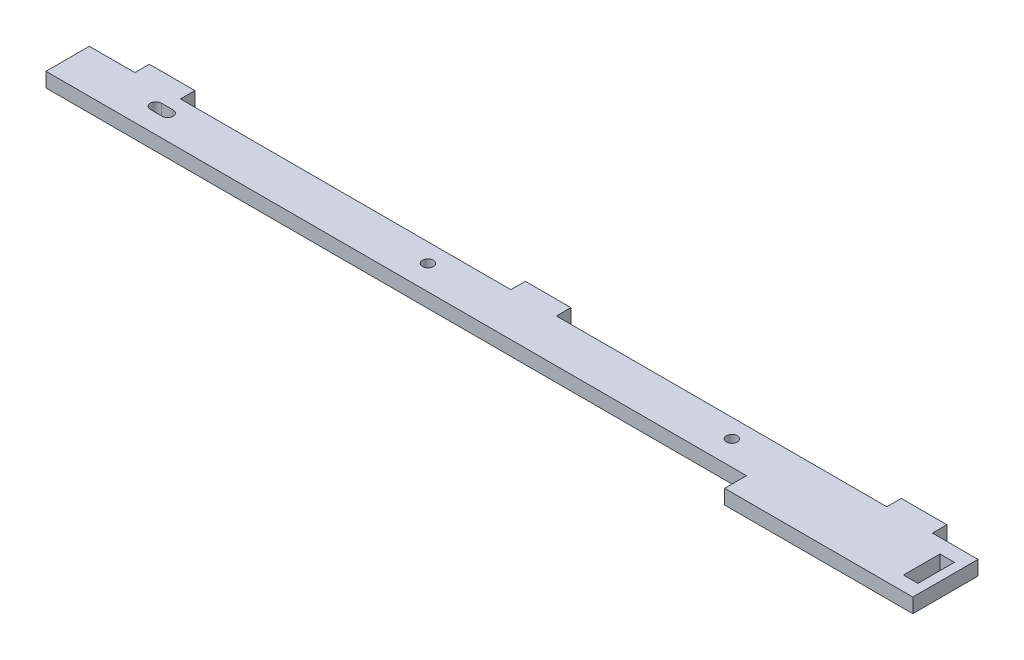
ISO-10303-21;
HEADER;
FILE_DESCRIPTION(('STEP AP214'),'2;1');
FILE_NAME('part.step','',(''),(''),'','','');
FILE_SCHEMA(('AUTOMOTIVE_DESIGN { 1 0 10303 214 1 1 1 1 }'));
ENDSEC;
DATA;
#1=APPLICATION_CONTEXT('core data for automotive mechanical design processes');
#2=APPLICATION_PROTOCOL_DEFINITION('international standard','automotive_design',2000,#1);
#3=PRODUCT_CONTEXT('',#1,'mechanical');
#4=PRODUCT('Part','Part','',(#3));
#5=PRODUCT_RELATED_PRODUCT_CATEGORY('part','',(#4));
#6=PRODUCT_DEFINITION_FORMATION('','',#4);
#7=PRODUCT_DEFINITION_CONTEXT('part definition',#1,'design');
#8=PRODUCT_DEFINITION('design','',#6,#7);
#9=PRODUCT_DEFINITION_SHAPE('','',#8);
#10=(LENGTH_UNIT() NAMED_UNIT(*) SI_UNIT(.MILLI.,.METRE.));
#11=(NAMED_UNIT(*) PLANE_ANGLE_UNIT() SI_UNIT($,.RADIAN.));
#12=(NAMED_UNIT(*) SI_UNIT($,.STERADIAN.) SOLID_ANGLE_UNIT());
#13=UNCERTAINTY_MEASURE_WITH_UNIT(LENGTH_MEASURE(1.E-05),#10,'distance_accuracy_value','');
#14=(GEOMETRIC_REPRESENTATION_CONTEXT(3) GLOBAL_UNCERTAINTY_ASSIGNED_CONTEXT((#13)) GLOBAL_UNIT_ASSIGNED_CONTEXT((#10,
#11,#12)) REPRESENTATION_CONTEXT('',''));
#15=CARTESIAN_POINT('',(0.,0.,0.));
#16=DIRECTION('',(0.,0.,1.));
#17=DIRECTION('',(1.,0.,0.));
#18=AXIS2_PLACEMENT_3D('',#15,#16,#17);
#19=CARTESIAN_POINT('',(97.5,3.175,4.74999999999999));
#20=DIRECTION('',(0.,0.,-1.));
#21=DIRECTION('',(-1.,0.,0.));
#22=AXIS2_PLACEMENT_3D('',#19,#20,#21);
#23=PLANE('',#22);
#24=DIRECTION('',(0.,-1.,0.));
#25=VECTOR('',#24,1.);
#26=CARTESIAN_POINT('',(56.2,3.17499999999999,4.75));
#27=LINE('',#26,#25);
#28=CARTESIAN_POINT('',(56.2,3.175,4.74999999999999));
#29=VERTEX_POINT('',#28);
#30=CARTESIAN_POINT('',(56.2,0.,4.75));
#31=VERTEX_POINT('',#30);
#32=EDGE_CURVE('E337',#29,#31,#27,.T.);
#33=ORIENTED_EDGE('',*,*,#32,.F.);
#34=DIRECTION('',(1.,0.,0.));
#35=VECTOR('',#34,1.);
#36=CARTESIAN_POINT('',(97.5,3.175,4.74999999999999));
#37=LINE('',#36,#35);
#38=CARTESIAN_POINT('',(-97.5,3.175,4.75000000000001));
#39=VERTEX_POINT('',#38);
#40=EDGE_CURVE('E458',#39,#29,#37,.T.);
#41=ORIENTED_EDGE('',*,*,#40,.F.);
#42=DIRECTION('',(0.,-1.,0.));
#43=VECTOR('',#42,1.);
#44=CARTESIAN_POINT('',(-97.5,3.175,4.75000000000001));
#45=LINE('',#44,#43);
#46=CARTESIAN_POINT('',(-97.5,0.,4.75000000000001));
#47=VERTEX_POINT('',#46);
#48=EDGE_CURVE('E486',#39,#47,#45,.T.);
#49=ORIENTED_EDGE('',*,*,#48,.T.);
#50=DIRECTION('',(1.,0.,0.));
#51=VECTOR('',#50,1.);
#52=CARTESIAN_POINT('',(97.5,0.,4.74999999999999));
#53=LINE('',#52,#51);
#54=EDGE_CURVE('E473',#47,#31,#53,.T.);
#55=ORIENTED_EDGE('',*,*,#54,.T.);
#56=EDGE_LOOP('',(#33,#41,#49,#55));
#57=FACE_BOUND('',#56,.T.);
#58=ADVANCED_FACE('F107',(#57),#23,.F.);
#59=CARTESIAN_POINT('',(97.5,3.175,-4.75000000000001));
#60=DIRECTION('',(0.,0.,1.));
#61=DIRECTION('',(1.,0.,0.));
#62=AXIS2_PLACEMENT_3D('',#59,#60,#61);
#63=PLANE('',#62);
#64=DIRECTION('',(0.,1.,0.));
#65=VECTOR('',#64,1.);
#66=CARTESIAN_POINT('',(-5.,0.,-4.75));
#67=LINE('',#66,#65);
#68=CARTESIAN_POINT('',(-5.,0.,-4.75));
#69=VERTEX_POINT('',#68);
#70=CARTESIAN_POINT('',(-5.,3.175,-4.75));
#71=VERTEX_POINT('',#70);
#72=EDGE_CURVE('E361',#69,#71,#67,.T.);
#73=ORIENTED_EDGE('',*,*,#72,.F.);
#74=DIRECTION('',(-1.,0.,0.));
#75=VECTOR('',#74,1.);
#76=CARTESIAN_POINT('',(97.5,0.,-4.75000000000001));
#77=LINE('',#76,#75);
#78=CARTESIAN_POINT('',(-77.5,0.,-4.74999999999999));
#79=VERTEX_POINT('',#78);
#80=EDGE_CURVE('E480',#69,#79,#77,.T.);
#81=ORIENTED_EDGE('',*,*,#80,.T.);
#82=DIRECTION('',(0.,-1.,0.));
#83=VECTOR('',#82,1.);
#84=CARTESIAN_POINT('',(-77.5,0.,-4.74999999999999));
#85=LINE('',#84,#83);
#86=CARTESIAN_POINT('',(-77.5,3.175,-4.74999999999999));
#87=VERTEX_POINT('',#86);
#88=EDGE_CURVE('E420',#87,#79,#85,.T.);
#89=ORIENTED_EDGE('',*,*,#88,.F.);
#90=DIRECTION('',(-1.,0.,0.));
#91=VECTOR('',#90,1.);
#92=CARTESIAN_POINT('',(97.5,3.175,-4.75000000000001));
#93=LINE('',#92,#91);
#94=EDGE_CURVE('E470',#71,#87,#93,.T.);
#95=ORIENTED_EDGE('',*,*,#94,.F.);
#96=EDGE_LOOP('',(#73,#81,#89,#95));
#97=FACE_BOUND('',#96,.T.);
#98=ADVANCED_FACE('F555',(#97),#63,.F.);
#99=DIRECTION('',(0.,-1.,0.));
#100=VECTOR('',#99,1.);
#101=CARTESIAN_POINT('',(5.,0.,-4.75));
#102=LINE('',#101,#100);
#103=CARTESIAN_POINT('',(5.,3.175,-4.75));
#104=VERTEX_POINT('',#103);
#105=CARTESIAN_POINT('',(5.,0.,-4.75));
#106=VERTEX_POINT('',#105);
#107=EDGE_CURVE('E366',#104,#106,#102,.T.);
#108=ORIENTED_EDGE('',*,*,#107,.F.);
#109=CARTESIAN_POINT('',(77.5,3.175,-4.75000000000001));
#110=VERTEX_POINT('',#109);
#111=EDGE_CURVE('E469',#110,#104,#93,.T.);
#112=ORIENTED_EDGE('',*,*,#111,.F.);
#113=DIRECTION('',(0.,1.,0.));
#114=VECTOR('',#113,1.);
#115=CARTESIAN_POINT('',(77.5,0.,-4.75000000000001));
#116=LINE('',#115,#114);
#117=CARTESIAN_POINT('',(77.5,0.,-4.75000000000001));
#118=VERTEX_POINT('',#117);
#119=EDGE_CURVE('E393',#118,#110,#116,.T.);
#120=ORIENTED_EDGE('',*,*,#119,.F.);
#121=EDGE_CURVE('E479',#118,#106,#77,.T.);
#122=ORIENTED_EDGE('',*,*,#121,.T.);
#123=EDGE_LOOP('',(#108,#112,#120,#122));
#124=FACE_BOUND('',#123,.T.);
#125=ADVANCED_FACE('F548',(#124),#63,.F.);
#126=DIRECTION('',(0.,-1.,0.));
#127=VECTOR('',#126,1.);
#128=CARTESIAN_POINT('',(87.5,0.,-4.75000000000001));
#129=LINE('',#128,#127);
#130=CARTESIAN_POINT('',(87.5,3.175,-4.75000000000001));
#131=VERTEX_POINT('',#130);
#132=CARTESIAN_POINT('',(87.5,0.,-4.75000000000001));
#133=VERTEX_POINT('',#132);
#134=EDGE_CURVE('E388',#131,#133,#129,.T.);
#135=ORIENTED_EDGE('',*,*,#134,.F.);
#136=CARTESIAN_POINT('',(97.5,3.175,-4.75000000000001));
#137=VERTEX_POINT('',#136);
#138=EDGE_CURVE('E465',#137,#131,#93,.T.);
#139=ORIENTED_EDGE('',*,*,#138,.F.);
#140=DIRECTION('',(0.,-1.,0.));
#141=VECTOR('',#140,1.);
#142=CARTESIAN_POINT('',(97.5,3.175,-4.75000000000001));
#143=LINE('',#142,#141);
#144=CARTESIAN_POINT('',(97.5,0.,-4.75000000000001));
#145=VERTEX_POINT('',#144);
#146=EDGE_CURVE('E483',#137,#145,#143,.T.);
#147=ORIENTED_EDGE('',*,*,#146,.T.);
#148=EDGE_CURVE('E459',#145,#133,#77,.T.);
#149=ORIENTED_EDGE('',*,*,#148,.T.);
#150=EDGE_LOOP('',(#135,#139,#147,#149));
#151=FACE_BOUND('',#150,.T.);
#152=ADVANCED_FACE('F598',(#151),#63,.F.);
#153=DIRECTION('',(0.,1.,0.));
#154=VECTOR('',#153,1.);
#155=CARTESIAN_POINT('',(-87.5,0.,-4.74999999999999));
#156=LINE('',#155,#154);
#157=CARTESIAN_POINT('',(-87.5,0.,-4.74999999999999));
#158=VERTEX_POINT('',#157);
#159=CARTESIAN_POINT('',(-87.5,3.175,-4.74999999999999));
#160=VERTEX_POINT('',#159);
#161=EDGE_CURVE('E415',#158,#160,#156,.T.);
#162=ORIENTED_EDGE('',*,*,#161,.F.);
#163=CARTESIAN_POINT('',(-97.5,0.,-4.74999999999999));
#164=VERTEX_POINT('',#163);
#165=EDGE_CURVE('E477',#158,#164,#77,.T.);
#166=ORIENTED_EDGE('',*,*,#165,.T.);
#167=DIRECTION('',(0.,-1.,0.));
#168=VECTOR('',#167,1.);
#169=CARTESIAN_POINT('',(-97.5,3.175,-4.74999999999999));
#170=LINE('',#169,#168);
#171=CARTESIAN_POINT('',(-97.5,3.175,-4.74999999999999));
#172=VERTEX_POINT('',#171);
#173=EDGE_CURVE('E468',#172,#164,#170,.T.);
#174=ORIENTED_EDGE('',*,*,#173,.F.);
#175=EDGE_CURVE('E464',#160,#172,#93,.T.);
#176=ORIENTED_EDGE('',*,*,#175,.F.);
#177=EDGE_LOOP('',(#162,#166,#174,#176));
#178=FACE_BOUND('',#177,.T.);
#179=ADVANCED_FACE('F569',(#178),#63,.F.);
#180=CARTESIAN_POINT('',(-97.5,3.175,4.75000000000001));
#181=DIRECTION('',(1.,0.,0.));
#182=DIRECTION('',(0.,0.,-1.));
#183=AXIS2_PLACEMENT_3D('',#180,#181,#182);
#184=PLANE('',#183);
#185=DIRECTION('',(0.,0.,1.));
#186=VECTOR('',#185,1.);
#187=CARTESIAN_POINT('',(-97.5,0.,4.75000000000001));
#188=LINE('',#187,#186);
#189=EDGE_CURVE('E454',#164,#47,#188,.T.);
#190=ORIENTED_EDGE('',*,*,#189,.T.);
#191=ORIENTED_EDGE('',*,*,#48,.F.);
#192=DIRECTION('',(0.,0.,1.));
#193=VECTOR('',#192,1.);
#194=CARTESIAN_POINT('',(-97.5,3.175,4.75000000000001));
#195=LINE('',#194,#193);
#196=EDGE_CURVE('E455',#172,#39,#195,.T.);
#197=ORIENTED_EDGE('',*,*,#196,.F.);
#198=ORIENTED_EDGE('',*,*,#173,.T.);
#199=EDGE_LOOP('',(#190,#191,#197,#198));
#200=FACE_BOUND('',#199,.T.);
#201=ADVANCED_FACE('F109',(#200),#184,.F.);
#202=CARTESIAN_POINT('',(97.5,3.175,4.74999999999999));
#203=DIRECTION('',(-1.,0.,0.));
#204=DIRECTION('',(0.,0.,1.));
#205=AXIS2_PLACEMENT_3D('',#202,#203,#204);
#206=PLANE('',#205);
#207=DIRECTION('',(0.,0.,-1.));
#208=VECTOR('',#207,1.);
#209=CARTESIAN_POINT('',(97.5,0.,4.74999999999999));
#210=LINE('',#209,#208);
#211=CARTESIAN_POINT('',(97.5,0.,9.55));
#212=VERTEX_POINT('',#211);
#213=EDGE_CURVE('E475',#212,#145,#210,.T.);
#214=ORIENTED_EDGE('',*,*,#213,.T.);
#215=ORIENTED_EDGE('',*,*,#146,.F.);
#216=DIRECTION('',(0.,0.,-1.));
#217=VECTOR('',#216,1.);
#218=CARTESIAN_POINT('',(97.5,3.175,4.74999999999999));
#219=LINE('',#218,#217);
#220=CARTESIAN_POINT('',(97.5,3.175,9.55));
#221=VERTEX_POINT('',#220);
#222=EDGE_CURVE('E462',#221,#137,#219,.T.);
#223=ORIENTED_EDGE('',*,*,#222,.F.);
#224=DIRECTION('',(0.,1.,0.));
#225=VECTOR('',#224,1.);
#226=CARTESIAN_POINT('',(97.5,3.175,9.55));
#227=LINE('',#226,#225);
#228=EDGE_CURVE('E343',#212,#221,#227,.T.);
#229=ORIENTED_EDGE('',*,*,#228,.F.);
#230=EDGE_LOOP('',(#214,#215,#223,#229));
#231=FACE_BOUND('',#230,.T.);
#232=ADVANCED_FACE('F500',(#231),#206,.F.);
#233=CARTESIAN_POINT('',(0.,3.175,0.));
#234=DIRECTION('',(0.,1.,0.));
#235=DIRECTION('',(0.,0.,1.));
#236=AXIS2_PLACEMENT_3D('',#233,#234,#235);
#237=PLANE('',#236);
#238=DIRECTION('',(-1.,0.,0.));
#239=VECTOR('',#238,1.);
#240=CARTESIAN_POINT('',(0.,3.175,-1.84999999999998));
#241=LINE('',#240,#239);
#242=CARTESIAN_POINT('',(-76.2,3.175,-1.84999999999998));
#243=VERTEX_POINT('',#242);
#244=CARTESIAN_POINT('',(-78.8,3.175,-1.84999999999998));
#245=VERTEX_POINT('',#244);
#246=EDGE_CURVE('E122',#243,#245,#241,.T.);
#247=ORIENTED_EDGE('',*,*,#246,.F.);
#248=CARTESIAN_POINT('',(-76.2,3.175,-0.649999999999989));
#249=DIRECTION('',(0.,1.,0.));
#250=DIRECTION('',(0.,0.,1.));
#251=AXIS2_PLACEMENT_3D('',#248,#249,#250);
#252=CIRCLE('',#251,1.19999999999999);
#253=CARTESIAN_POINT('',(-76.2,3.175,0.550000000000078));
#254=VERTEX_POINT('',#253);
#255=EDGE_CURVE('E293',#254,#243,#252,.T.);
#256=ORIENTED_EDGE('',*,*,#255,.F.);
#257=DIRECTION('',(1.,0.,0.));
#258=VECTOR('',#257,1.);
#259=CARTESIAN_POINT('',(-78.8,3.175,0.550000000000078));
#260=LINE('',#259,#258);
#261=CARTESIAN_POINT('',(-78.8,3.175,0.550000000000004));
#262=VERTEX_POINT('',#261);
#263=EDGE_CURVE('E488',#262,#254,#260,.T.);
#264=ORIENTED_EDGE('',*,*,#263,.F.);
#265=CARTESIAN_POINT('',(-78.8,3.175,-0.649999999999989));
#266=DIRECTION('',(0.,1.,0.));
#267=DIRECTION('',(0.,0.,1.));
#268=AXIS2_PLACEMENT_3D('',#265,#266,#267);
#269=CIRCLE('',#268,1.19999999999999);
#270=EDGE_CURVE('E299',#245,#262,#269,.T.);
#271=ORIENTED_EDGE('',*,*,#270,.F.);
#272=EDGE_LOOP('',(#247,#256,#264,#271));
#273=FACE_BOUND('',#272,.T.);
#274=DIRECTION('',(0.,0.,1.));
#275=VECTOR('',#274,1.);
#276=CARTESIAN_POINT('',(92.3,3.175,-1.60000000000001));
#277=LINE('',#276,#275);
#278=CARTESIAN_POINT('',(92.3,3.175,-1.60000000000001));
#279=VERTEX_POINT('',#278);
#280=CARTESIAN_POINT('',(92.3,3.175,6.39999999999999));
#281=VERTEX_POINT('',#280);
#282=EDGE_CURVE('E130',#279,#281,#277,.T.);
#283=ORIENTED_EDGE('',*,*,#282,.F.);
#284=DIRECTION('',(-1.,0.,0.));
#285=VECTOR('',#284,1.);
#286=CARTESIAN_POINT('',(92.3,3.175,-1.60000000000001));
#287=LINE('',#286,#285);
#288=CARTESIAN_POINT('',(95.475,3.175,-1.60000000000001));
#289=VERTEX_POINT('',#288);
#290=EDGE_CURVE('E316',#289,#279,#287,.T.);
#291=ORIENTED_EDGE('',*,*,#290,.F.);
#292=DIRECTION('',(0.,0.,-1.));
#293=VECTOR('',#292,1.);
#294=CARTESIAN_POINT('',(95.475,3.175,-1.60000000000001));
#295=LINE('',#294,#293);
#296=CARTESIAN_POINT('',(95.475,3.175,6.39999999999999));
#297=VERTEX_POINT('',#296);
#298=EDGE_CURVE('E330',#297,#289,#295,.T.);
#299=ORIENTED_EDGE('',*,*,#298,.F.);
#300=DIRECTION('',(1.,0.,0.));
#301=VECTOR('',#300,1.);
#302=CARTESIAN_POINT('',(92.3,3.175,6.39999999999999));
#303=LINE('',#302,#301);
#304=EDGE_CURVE('E327',#281,#297,#303,.T.);
#305=ORIENTED_EDGE('',*,*,#304,.F.);
#306=EDGE_LOOP('',(#283,#291,#299,#305));
#307=FACE_BOUND('',#306,.T.);
#308=CARTESIAN_POINT('',(47.6,3.175,-0.649999999999989));
#309=DIRECTION('',(0.,1.,0.));
#310=DIRECTION('',(0.,0.,1.));
#311=AXIS2_PLACEMENT_3D('',#308,#309,#310);
#312=CIRCLE('',#311,1.2);
#313=CARTESIAN_POINT('',(47.6,3.175,0.550000000000011));
#314=VERTEX_POINT('',#313);
#315=EDGE_CURVE('E442',#314,#314,#312,.T.);
#316=ORIENTED_EDGE('',*,*,#315,.F.);
#317=EDGE_LOOP('',(#316));
#318=FACE_BOUND('',#317,.T.);
#319=CARTESIAN_POINT('',(-19.1,3.175,-0.649999999999989));
#320=DIRECTION('',(0.,1.,0.));
#321=DIRECTION('',(0.,0.,1.));
#322=AXIS2_PLACEMENT_3D('',#319,#320,#321);
#323=CIRCLE('',#322,1.2);
#324=CARTESIAN_POINT('',(-19.1,3.175,0.550000000000011));
#325=VERTEX_POINT('',#324);
#326=EDGE_CURVE('E448',#325,#325,#323,.T.);
#327=ORIENTED_EDGE('',*,*,#326,.F.);
#328=EDGE_LOOP('',(#327));
#329=FACE_BOUND('',#328,.T.);
#330=ORIENTED_EDGE('',*,*,#196,.T.);
#331=ORIENTED_EDGE('',*,*,#40,.T.);
#332=DIRECTION('',(0.,0.,-1.));
#333=VECTOR('',#332,1.);
#334=CARTESIAN_POINT('',(56.2,3.17499999999999,9.55));
#335=LINE('',#334,#333);
#336=CARTESIAN_POINT('',(56.2,3.17499999999999,9.55));
#337=VERTEX_POINT('',#336);
#338=EDGE_CURVE('E358',#337,#29,#335,.T.);
#339=ORIENTED_EDGE('',*,*,#338,.F.);
#340=DIRECTION('',(-1.,0.,0.));
#341=VECTOR('',#340,1.);
#342=CARTESIAN_POINT('',(97.5,3.175,9.55));
#343=LINE('',#342,#341);
#344=EDGE_CURVE('E346',#221,#337,#343,.T.);
#345=ORIENTED_EDGE('',*,*,#344,.F.);
#346=ORIENTED_EDGE('',*,*,#222,.T.);
#347=ORIENTED_EDGE('',*,*,#138,.T.);
#348=DIRECTION('',(0.,0.,1.));
#349=VECTOR('',#348,1.);
#350=CARTESIAN_POINT('',(87.5,3.175,-7.92500000000001));
#351=LINE('',#350,#349);
#352=CARTESIAN_POINT('',(87.5,3.175,-7.92500000000001));
#353=VERTEX_POINT('',#352);
#354=EDGE_CURVE('E399',#353,#131,#351,.T.);
#355=ORIENTED_EDGE('',*,*,#354,.F.);
#356=DIRECTION('',(1.,0.,0.));
#357=VECTOR('',#356,1.);
#358=CARTESIAN_POINT('',(87.5,3.175,-7.92500000000001));
#359=LINE('',#358,#357);
#360=CARTESIAN_POINT('',(77.5,3.175,-7.92500000000001));
#361=VERTEX_POINT('',#360);
#362=EDGE_CURVE('E397',#361,#353,#359,.T.);
#363=ORIENTED_EDGE('',*,*,#362,.F.);
#364=DIRECTION('',(0.,0.,1.));
#365=VECTOR('',#364,1.);
#366=CARTESIAN_POINT('',(77.5,3.175,-7.92500000000001));
#367=LINE('',#366,#365);
#368=EDGE_CURVE('E406',#361,#110,#367,.T.);
#369=ORIENTED_EDGE('',*,*,#368,.T.);
#370=ORIENTED_EDGE('',*,*,#111,.T.);
#371=DIRECTION('',(0.,0.,1.));
#372=VECTOR('',#371,1.);
#373=CARTESIAN_POINT('',(5.,3.175,-7.925));
#374=LINE('',#373,#372);
#375=CARTESIAN_POINT('',(5.,3.175,-7.925));
#376=VERTEX_POINT('',#375);
#377=EDGE_CURVE('E382',#376,#104,#374,.T.);
#378=ORIENTED_EDGE('',*,*,#377,.F.);
#379=DIRECTION('',(1.,0.,0.));
#380=VECTOR('',#379,1.);
#381=CARTESIAN_POINT('',(-5.00000000000001,3.175,-7.925));
#382=LINE('',#381,#380);
#383=CARTESIAN_POINT('',(-5.00000000000001,3.175,-7.925));
#384=VERTEX_POINT('',#383);
#385=EDGE_CURVE('E365',#384,#376,#382,.T.);
#386=ORIENTED_EDGE('',*,*,#385,.F.);
#387=DIRECTION('',(0.,0.,1.));
#388=VECTOR('',#387,1.);
#389=CARTESIAN_POINT('',(-5.00000000000001,3.175,-7.925));
#390=LINE('',#389,#388);
#391=EDGE_CURVE('E385',#384,#71,#390,.T.);
#392=ORIENTED_EDGE('',*,*,#391,.T.);
#393=ORIENTED_EDGE('',*,*,#94,.T.);
#394=DIRECTION('',(0.,0.,1.));
#395=VECTOR('',#394,1.);
#396=CARTESIAN_POINT('',(-77.5,3.175,-7.92499999999999));
#397=LINE('',#396,#395);
#398=CARTESIAN_POINT('',(-77.5,3.175,-7.92499999999999));
#399=VERTEX_POINT('',#398);
#400=EDGE_CURVE('E436',#399,#87,#397,.T.);
#401=ORIENTED_EDGE('',*,*,#400,.F.);
#402=DIRECTION('',(1.,0.,0.));
#403=VECTOR('',#402,1.);
#404=CARTESIAN_POINT('',(-87.5,3.175,-7.92499999999999));
#405=LINE('',#404,#403);
#406=CARTESIAN_POINT('',(-87.5,3.175,-7.92499999999999));
#407=VERTEX_POINT('',#406);
#408=EDGE_CURVE('E419',#407,#399,#405,.T.);
#409=ORIENTED_EDGE('',*,*,#408,.F.);
#410=DIRECTION('',(0.,0.,1.));
#411=VECTOR('',#410,1.);
#412=CARTESIAN_POINT('',(-87.5,3.175,-7.92499999999999));
#413=LINE('',#412,#411);
#414=EDGE_CURVE('E439',#407,#160,#413,.T.);
#415=ORIENTED_EDGE('',*,*,#414,.T.);
#416=ORIENTED_EDGE('',*,*,#175,.T.);
#417=EDGE_LOOP('',(#330,#331,#339,#345,#346,#347,#355,#363,#369,#370,#378,#386,#392,#393,#401,
#409,#415,#416));
#418=FACE_BOUND('',#417,.T.);
#419=ADVANCED_FACE('F497',(#273,#307,#318,#329,#418),#237,.T.);
#420=CARTESIAN_POINT('',(0.,0.,0.));
#421=DIRECTION('',(0.,1.,0.));
#422=DIRECTION('',(0.,0.,1.));
#423=AXIS2_PLACEMENT_3D('',#420,#421,#422);
#424=PLANE('',#423);
#425=DIRECTION('',(-1.,0.,0.));
#426=VECTOR('',#425,1.);
#427=CARTESIAN_POINT('',(92.3,0.,-1.60000000000001));
#428=LINE('',#427,#426);
#429=CARTESIAN_POINT('',(95.475,0.,-1.60000000000001));
#430=VERTEX_POINT('',#429);
#431=CARTESIAN_POINT('',(92.3,0.,-1.60000000000001));
#432=VERTEX_POINT('',#431);
#433=EDGE_CURVE('E322',#430,#432,#428,.T.);
#434=ORIENTED_EDGE('',*,*,#433,.T.);
#435=DIRECTION('',(0.,0.,1.));
#436=VECTOR('',#435,1.);
#437=CARTESIAN_POINT('',(92.3,0.,-1.60000000000001));
#438=LINE('',#437,#436);
#439=CARTESIAN_POINT('',(92.3,0.,6.39999999999999));
#440=VERTEX_POINT('',#439);
#441=EDGE_CURVE('E312',#432,#440,#438,.T.);
#442=ORIENTED_EDGE('',*,*,#441,.T.);
#443=DIRECTION('',(1.,0.,0.));
#444=VECTOR('',#443,1.);
#445=CARTESIAN_POINT('',(92.3,0.,6.39999999999999));
#446=LINE('',#445,#444);
#447=CARTESIAN_POINT('',(95.475,0.,6.39999999999999));
#448=VERTEX_POINT('',#447);
#449=EDGE_CURVE('E315',#440,#448,#446,.T.);
#450=ORIENTED_EDGE('',*,*,#449,.T.);
#451=DIRECTION('',(0.,0.,-1.));
#452=VECTOR('',#451,1.);
#453=CARTESIAN_POINT('',(95.475,0.,-1.60000000000001));
#454=LINE('',#453,#452);
#455=EDGE_CURVE('E319',#448,#430,#454,.T.);
#456=ORIENTED_EDGE('',*,*,#455,.T.);
#457=EDGE_LOOP('',(#434,#442,#450,#456));
#458=FACE_BOUND('',#457,.T.);
#459=CARTESIAN_POINT('',(-78.8,0.,-0.649999999999989));
#460=DIRECTION('',(0.,1.,0.));
#461=DIRECTION('',(0.,0.,1.));
#462=AXIS2_PLACEMENT_3D('',#459,#460,#461);
#463=CIRCLE('',#462,1.19999999999999);
#464=CARTESIAN_POINT('',(-78.8,0.,-1.84999999999998));
#465=VERTEX_POINT('',#464);
#466=CARTESIAN_POINT('',(-78.8,0.,0.550000000000004));
#467=VERTEX_POINT('',#466);
#468=EDGE_CURVE('E284',#465,#467,#463,.T.);
#469=ORIENTED_EDGE('',*,*,#468,.T.);
#470=DIRECTION('',(1.,0.,0.));
#471=VECTOR('',#470,1.);
#472=CARTESIAN_POINT('',(0.,0.,0.550000000000004));
#473=LINE('',#472,#471);
#474=CARTESIAN_POINT('',(-76.2,0.,0.550000000000004));
#475=VERTEX_POINT('',#474);
#476=EDGE_CURVE('E13',#467,#475,#473,.T.);
#477=ORIENTED_EDGE('',*,*,#476,.T.);
#478=CARTESIAN_POINT('',(-76.2,0.,-0.649999999999989));
#479=DIRECTION('',(0.,1.,0.));
#480=DIRECTION('',(0.,0.,1.));
#481=AXIS2_PLACEMENT_3D('',#478,#479,#480);
#482=CIRCLE('',#481,1.19999999999999);
#483=CARTESIAN_POINT('',(-76.2,0.,-1.84999999999998));
#484=VERTEX_POINT('',#483);
#485=EDGE_CURVE('E285',#475,#484,#482,.T.);
#486=ORIENTED_EDGE('',*,*,#485,.T.);
#487=DIRECTION('',(1.,0.,0.));
#488=VECTOR('',#487,1.);
#489=CARTESIAN_POINT('',(-78.8,0.,-1.84999999999998));
#490=LINE('',#489,#488);
#491=EDGE_CURVE('E115',#465,#484,#490,.T.);
#492=ORIENTED_EDGE('',*,*,#491,.F.);
#493=EDGE_LOOP('',(#469,#477,#486,#492));
#494=FACE_BOUND('',#493,.T.);
#495=CARTESIAN_POINT('',(47.6,0.,-0.649999999999989));
#496=DIRECTION('',(0.,1.,0.));
#497=DIRECTION('',(0.,0.,1.));
#498=AXIS2_PLACEMENT_3D('',#495,#496,#497);
#499=CIRCLE('',#498,1.2);
#500=CARTESIAN_POINT('',(47.6,0.,0.550000000000011));
#501=VERTEX_POINT('',#500);
#502=EDGE_CURVE('E445',#501,#501,#499,.T.);
#503=ORIENTED_EDGE('',*,*,#502,.T.);
#504=EDGE_LOOP('',(#503));
#505=FACE_BOUND('',#504,.T.);
#506=CARTESIAN_POINT('',(-19.1,0.,-0.649999999999989));
#507=DIRECTION('',(0.,1.,0.));
#508=DIRECTION('',(0.,0.,1.));
#509=AXIS2_PLACEMENT_3D('',#506,#507,#508);
#510=CIRCLE('',#509,1.2);
#511=CARTESIAN_POINT('',(-19.1,0.,0.550000000000007));
#512=VERTEX_POINT('',#511);
#513=EDGE_CURVE('E451',#512,#512,#510,.T.);
#514=ORIENTED_EDGE('',*,*,#513,.T.);
#515=EDGE_LOOP('',(#514));
#516=FACE_BOUND('',#515,.T.);
#517=ORIENTED_EDGE('',*,*,#189,.F.);
#518=ORIENTED_EDGE('',*,*,#165,.F.);
#519=DIRECTION('',(0.,0.,1.));
#520=VECTOR('',#519,1.);
#521=CARTESIAN_POINT('',(-87.5,0.,-7.92499999999999));
#522=LINE('',#521,#520);
#523=CARTESIAN_POINT('',(-87.5,0.,-7.92499999999999));
#524=VERTEX_POINT('',#523);
#525=EDGE_CURVE('E426',#524,#158,#522,.T.);
#526=ORIENTED_EDGE('',*,*,#525,.F.);
#527=DIRECTION('',(-1.,0.,0.));
#528=VECTOR('',#527,1.);
#529=CARTESIAN_POINT('',(-87.5,0.,-7.92499999999999));
#530=LINE('',#529,#528);
#531=CARTESIAN_POINT('',(-77.5,0.,-7.92499999999999));
#532=VERTEX_POINT('',#531);
#533=EDGE_CURVE('E424',#532,#524,#530,.T.);
#534=ORIENTED_EDGE('',*,*,#533,.F.);
#535=DIRECTION('',(0.,0.,1.));
#536=VECTOR('',#535,1.);
#537=CARTESIAN_POINT('',(-77.5,0.,-7.92499999999999));
#538=LINE('',#537,#536);
#539=EDGE_CURVE('E433',#532,#79,#538,.T.);
#540=ORIENTED_EDGE('',*,*,#539,.T.);
#541=ORIENTED_EDGE('',*,*,#80,.F.);
#542=DIRECTION('',(0.,0.,1.));
#543=VECTOR('',#542,1.);
#544=CARTESIAN_POINT('',(-5.,0.,-7.925));
#545=LINE('',#544,#543);
#546=CARTESIAN_POINT('',(-5.,0.,-7.925));
#547=VERTEX_POINT('',#546);
#548=EDGE_CURVE('E372',#547,#69,#545,.T.);
#549=ORIENTED_EDGE('',*,*,#548,.F.);
#550=DIRECTION('',(-1.,0.,0.));
#551=VECTOR('',#550,1.);
#552=CARTESIAN_POINT('',(-5.,0.,-7.925));
#553=LINE('',#552,#551);
#554=CARTESIAN_POINT('',(5.,0.,-7.925));
#555=VERTEX_POINT('',#554);
#556=EDGE_CURVE('E370',#555,#547,#553,.T.);
#557=ORIENTED_EDGE('',*,*,#556,.F.);
#558=DIRECTION('',(0.,0.,1.));
#559=VECTOR('',#558,1.);
#560=CARTESIAN_POINT('',(5.,0.,-7.925));
#561=LINE('',#560,#559);
#562=EDGE_CURVE('E379',#555,#106,#561,.T.);
#563=ORIENTED_EDGE('',*,*,#562,.T.);
#564=ORIENTED_EDGE('',*,*,#121,.F.);
#565=DIRECTION('',(0.,0.,1.));
#566=VECTOR('',#565,1.);
#567=CARTESIAN_POINT('',(77.5,0.,-7.92500000000001));
#568=LINE('',#567,#566);
#569=CARTESIAN_POINT('',(77.5,0.,-7.92500000000001));
#570=VERTEX_POINT('',#569);
#571=EDGE_CURVE('E409',#570,#118,#568,.T.);
#572=ORIENTED_EDGE('',*,*,#571,.F.);
#573=DIRECTION('',(-1.,0.,0.));
#574=VECTOR('',#573,1.);
#575=CARTESIAN_POINT('',(87.5,0.,-7.92500000000001));
#576=LINE('',#575,#574);
#577=CARTESIAN_POINT('',(87.5,0.,-7.92500000000001));
#578=VERTEX_POINT('',#577);
#579=EDGE_CURVE('E392',#578,#570,#576,.T.);
#580=ORIENTED_EDGE('',*,*,#579,.F.);
#581=DIRECTION('',(0.,0.,1.));
#582=VECTOR('',#581,1.);
#583=CARTESIAN_POINT('',(87.5,0.,-7.92500000000001));
#584=LINE('',#583,#582);
#585=EDGE_CURVE('E412',#578,#133,#584,.T.);
#586=ORIENTED_EDGE('',*,*,#585,.T.);
#587=ORIENTED_EDGE('',*,*,#148,.F.);
#588=ORIENTED_EDGE('',*,*,#213,.F.);
#589=DIRECTION('',(1.,0.,0.));
#590=VECTOR('',#589,1.);
#591=CARTESIAN_POINT('',(97.5,0.,9.55));
#592=LINE('',#591,#590);
#593=CARTESIAN_POINT('',(56.2,0.,9.55));
#594=VERTEX_POINT('',#593);
#595=EDGE_CURVE('E350',#594,#212,#592,.T.);
#596=ORIENTED_EDGE('',*,*,#595,.F.);
#597=DIRECTION('',(0.,0.,-1.));
#598=VECTOR('',#597,1.);
#599=CARTESIAN_POINT('',(56.2,0.,9.55));
#600=LINE('',#599,#598);
#601=EDGE_CURVE('E353',#594,#31,#600,.T.);
#602=ORIENTED_EDGE('',*,*,#601,.T.);
#603=ORIENTED_EDGE('',*,*,#54,.F.);
#604=EDGE_LOOP('',(#517,#518,#526,#534,#540,#541,#549,#557,#563,#564,#572,#580,#586,#587,#588,
#596,#602,#603));
#605=FACE_BOUND('',#604,.T.);
#606=ADVANCED_FACE('F281',(#458,#494,#505,#516,#605),#424,.F.);
#607=CARTESIAN_POINT('',(-19.1,3.175,-0.649999999999989));
#608=DIRECTION('',(0.,1.,0.));
#609=DIRECTION('',(0.,0.,1.));
#610=AXIS2_PLACEMENT_3D('',#607,#608,#609);
#611=CYLINDRICAL_SURFACE('',#610,1.2);
#612=ORIENTED_EDGE('',*,*,#513,.F.);
#613=EDGE_LOOP('',(#612));
#614=FACE_BOUND('',#613,.T.);
#615=ORIENTED_EDGE('',*,*,#326,.T.);
#616=EDGE_LOOP('',(#615));
#617=FACE_BOUND('',#616,.T.);
#618=ADVANCED_FACE('F600',(#614,#617),#611,.F.);
#619=CARTESIAN_POINT('',(47.6,3.175,-0.649999999999989));
#620=DIRECTION('',(0.,1.,0.));
#621=DIRECTION('',(0.,0.,1.));
#622=AXIS2_PLACEMENT_3D('',#619,#620,#621);
#623=CYLINDRICAL_SURFACE('',#622,1.2);
#624=ORIENTED_EDGE('',*,*,#502,.F.);
#625=EDGE_LOOP('',(#624));
#626=FACE_BOUND('',#625,.T.);
#627=ORIENTED_EDGE('',*,*,#315,.T.);
#628=EDGE_LOOP('',(#627));
#629=FACE_BOUND('',#628,.T.);
#630=ADVANCED_FACE('F605',(#626,#629),#623,.F.);
#631=CARTESIAN_POINT('',(-87.5,0.,-7.92499999999999));
#632=DIRECTION('',(1.,0.,0.));
#633=DIRECTION('',(0.,1.,0.));
#634=AXIS2_PLACEMENT_3D('',#631,#632,#633);
#635=PLANE('',#634);
#636=ORIENTED_EDGE('',*,*,#161,.T.);
#637=ORIENTED_EDGE('',*,*,#414,.F.);
#638=DIRECTION('',(0.,1.,0.));
#639=VECTOR('',#638,1.);
#640=CARTESIAN_POINT('',(-87.5,0.,-7.92499999999999));
#641=LINE('',#640,#639);
#642=EDGE_CURVE('E416',#524,#407,#641,.T.);
#643=ORIENTED_EDGE('',*,*,#642,.F.);
#644=ORIENTED_EDGE('',*,*,#525,.T.);
#645=EDGE_LOOP('',(#636,#637,#643,#644));
#646=FACE_BOUND('',#645,.T.);
#647=ADVANCED_FACE('F566',(#646),#635,.F.);
#648=CARTESIAN_POINT('',(-77.5,0.,-7.92499999999999));
#649=DIRECTION('',(-1.,0.,0.));
#650=DIRECTION('',(0.,0.,1.));
#651=AXIS2_PLACEMENT_3D('',#648,#649,#650);
#652=PLANE('',#651);
#653=ORIENTED_EDGE('',*,*,#88,.T.);
#654=ORIENTED_EDGE('',*,*,#539,.F.);
#655=DIRECTION('',(0.,-1.,0.));
#656=VECTOR('',#655,1.);
#657=CARTESIAN_POINT('',(-77.5,0.,-7.92499999999999));
#658=LINE('',#657,#656);
#659=EDGE_CURVE('E422',#399,#532,#658,.T.);
#660=ORIENTED_EDGE('',*,*,#659,.F.);
#661=ORIENTED_EDGE('',*,*,#400,.T.);
#662=EDGE_LOOP('',(#653,#654,#660,#661));
#663=FACE_BOUND('',#662,.T.);
#664=ADVANCED_FACE('F558',(#663),#652,.F.);
#665=CARTESIAN_POINT('',(0.,0.,-7.925));
#666=DIRECTION('',(0.,0.,-1.));
#667=DIRECTION('',(-1.,0.,0.));
#668=AXIS2_PLACEMENT_3D('',#665,#666,#667);
#669=PLANE('',#668);
#670=ORIENTED_EDGE('',*,*,#642,.T.);
#671=ORIENTED_EDGE('',*,*,#408,.T.);
#672=ORIENTED_EDGE('',*,*,#659,.T.);
#673=ORIENTED_EDGE('',*,*,#533,.T.);
#674=EDGE_LOOP('',(#670,#671,#672,#673));
#675=FACE_BOUND('',#674,.T.);
#676=ADVANCED_FACE('F561',(#675),#669,.T.);
#677=CARTESIAN_POINT('',(87.5,0.,-7.92500000000001));
#678=DIRECTION('',(-1.,0.,0.));
#679=DIRECTION('',(0.,-1.,0.));
#680=AXIS2_PLACEMENT_3D('',#677,#678,#679);
#681=PLANE('',#680);
#682=ORIENTED_EDGE('',*,*,#134,.T.);
#683=ORIENTED_EDGE('',*,*,#585,.F.);
#684=DIRECTION('',(0.,-1.,0.));
#685=VECTOR('',#684,1.);
#686=CARTESIAN_POINT('',(87.5,0.,-7.92500000000001));
#687=LINE('',#686,#685);
#688=EDGE_CURVE('E389',#353,#578,#687,.T.);
#689=ORIENTED_EDGE('',*,*,#688,.F.);
#690=ORIENTED_EDGE('',*,*,#354,.T.);
#691=EDGE_LOOP('',(#682,#683,#689,#690));
#692=FACE_BOUND('',#691,.T.);
#693=ADVANCED_FACE('F535',(#692),#681,.F.);
#694=CARTESIAN_POINT('',(77.5,0.,-7.92500000000001));
#695=DIRECTION('',(1.,0.,0.));
#696=DIRECTION('',(0.,0.,-1.));
#697=AXIS2_PLACEMENT_3D('',#694,#695,#696);
#698=PLANE('',#697);
#699=ORIENTED_EDGE('',*,*,#119,.T.);
#700=ORIENTED_EDGE('',*,*,#368,.F.);
#701=DIRECTION('',(0.,1.,0.));
#702=VECTOR('',#701,1.);
#703=CARTESIAN_POINT('',(77.5,0.,-7.92500000000001));
#704=LINE('',#703,#702);
#705=EDGE_CURVE('E395',#570,#361,#704,.T.);
#706=ORIENTED_EDGE('',*,*,#705,.F.);
#707=ORIENTED_EDGE('',*,*,#571,.T.);
#708=EDGE_LOOP('',(#699,#700,#706,#707));
#709=FACE_BOUND('',#708,.T.);
#710=ADVANCED_FACE('F545',(#709),#698,.F.);
#711=CARTESIAN_POINT('',(0.,0.,-7.925));
#712=DIRECTION('',(0.,0.,1.));
#713=DIRECTION('',(1.,0.,0.));
#714=AXIS2_PLACEMENT_3D('',#711,#712,#713);
#715=PLANE('',#714);
#716=ORIENTED_EDGE('',*,*,#688,.T.);
#717=ORIENTED_EDGE('',*,*,#579,.T.);
#718=ORIENTED_EDGE('',*,*,#705,.T.);
#719=ORIENTED_EDGE('',*,*,#362,.T.);
#720=EDGE_LOOP('',(#716,#717,#718,#719));
#721=FACE_BOUND('',#720,.T.);
#722=ADVANCED_FACE('F538',(#721),#715,.F.);
#723=CARTESIAN_POINT('',(-5.,0.,-7.925));
#724=DIRECTION('',(1.,0.,0.));
#725=DIRECTION('',(0.,1.,0.));
#726=AXIS2_PLACEMENT_3D('',#723,#724,#725);
#727=PLANE('',#726);
#728=ORIENTED_EDGE('',*,*,#72,.T.);
#729=ORIENTED_EDGE('',*,*,#391,.F.);
#730=DIRECTION('',(0.,1.,0.));
#731=VECTOR('',#730,1.);
#732=CARTESIAN_POINT('',(-5.,0.,-7.925));
#733=LINE('',#732,#731);
#734=EDGE_CURVE('E362',#547,#384,#733,.T.);
#735=ORIENTED_EDGE('',*,*,#734,.F.);
#736=ORIENTED_EDGE('',*,*,#548,.T.);
#737=EDGE_LOOP('',(#728,#729,#735,#736));
#738=FACE_BOUND('',#737,.T.);
#739=ADVANCED_FACE('F574',(#738),#727,.F.);
#740=CARTESIAN_POINT('',(5.,0.,-7.925));
#741=DIRECTION('',(-1.,0.,0.));
#742=DIRECTION('',(0.,-1.,0.));
#743=AXIS2_PLACEMENT_3D('',#740,#741,#742);
#744=PLANE('',#743);
#745=ORIENTED_EDGE('',*,*,#107,.T.);
#746=ORIENTED_EDGE('',*,*,#562,.F.);
#747=DIRECTION('',(0.,-1.,0.));
#748=VECTOR('',#747,1.);
#749=CARTESIAN_POINT('',(5.,0.,-7.925));
#750=LINE('',#749,#748);
#751=EDGE_CURVE('E368',#376,#555,#750,.T.);
#752=ORIENTED_EDGE('',*,*,#751,.F.);
#753=ORIENTED_EDGE('',*,*,#377,.T.);
#754=EDGE_LOOP('',(#745,#746,#752,#753));
#755=FACE_BOUND('',#754,.T.);
#756=ADVANCED_FACE('F580',(#755),#744,.F.);
#757=CARTESIAN_POINT('',(0.,0.,-7.925));
#758=DIRECTION('',(0.,0.,-1.));
#759=DIRECTION('',(-1.,0.,0.));
#760=AXIS2_PLACEMENT_3D('',#757,#758,#759);
#761=PLANE('',#760);
#762=ORIENTED_EDGE('',*,*,#734,.T.);
#763=ORIENTED_EDGE('',*,*,#385,.T.);
#764=ORIENTED_EDGE('',*,*,#751,.T.);
#765=ORIENTED_EDGE('',*,*,#556,.T.);
#766=EDGE_LOOP('',(#762,#763,#764,#765));
#767=FACE_BOUND('',#766,.T.);
#768=ADVANCED_FACE('F576',(#767),#761,.T.);
#769=CARTESIAN_POINT('',(56.2,3.17499999999999,9.55));
#770=DIRECTION('',(1.,0.,0.));
#771=DIRECTION('',(0.,1.,0.));
#772=AXIS2_PLACEMENT_3D('',#769,#770,#771);
#773=PLANE('',#772);
#774=ORIENTED_EDGE('',*,*,#32,.T.);
#775=ORIENTED_EDGE('',*,*,#601,.F.);
#776=DIRECTION('',(0.,-1.,0.));
#777=VECTOR('',#776,1.);
#778=CARTESIAN_POINT('',(56.2,3.17499999999999,9.55));
#779=LINE('',#778,#777);
#780=EDGE_CURVE('E348',#337,#594,#779,.T.);
#781=ORIENTED_EDGE('',*,*,#780,.F.);
#782=ORIENTED_EDGE('',*,*,#338,.T.);
#783=EDGE_LOOP('',(#774,#775,#781,#782));
#784=FACE_BOUND('',#783,.T.);
#785=ADVANCED_FACE('F518',(#784),#773,.F.);
#786=CARTESIAN_POINT('',(0.,0.,9.55));
#787=DIRECTION('',(0.,0.,-1.));
#788=DIRECTION('',(-1.,0.,0.));
#789=AXIS2_PLACEMENT_3D('',#786,#787,#788);
#790=PLANE('',#789);
#791=ORIENTED_EDGE('',*,*,#228,.T.);
#792=ORIENTED_EDGE('',*,*,#344,.T.);
#793=ORIENTED_EDGE('',*,*,#780,.T.);
#794=ORIENTED_EDGE('',*,*,#595,.T.);
#795=EDGE_LOOP('',(#791,#792,#793,#794));
#796=FACE_BOUND('',#795,.T.);
#797=ADVANCED_FACE('F525',(#796),#790,.F.);
#798=CARTESIAN_POINT('',(92.3,0.,-1.60000000000001));
#799=DIRECTION('',(-1.,0.,0.));
#800=DIRECTION('',(0.,0.,1.));
#801=AXIS2_PLACEMENT_3D('',#798,#799,#800);
#802=PLANE('',#801);
#803=ORIENTED_EDGE('',*,*,#282,.T.);
#804=DIRECTION('',(0.,1.,0.));
#805=VECTOR('',#804,1.);
#806=CARTESIAN_POINT('',(92.3,0.,6.39999999999999));
#807=LINE('',#806,#805);
#808=EDGE_CURVE('E325',#440,#281,#807,.T.);
#809=ORIENTED_EDGE('',*,*,#808,.F.);
#810=ORIENTED_EDGE('',*,*,#441,.F.);
#811=DIRECTION('',(0.,1.,0.));
#812=VECTOR('',#811,1.);
#813=CARTESIAN_POINT('',(92.3,0.,-1.60000000000001));
#814=LINE('',#813,#812);
#815=EDGE_CURVE('E335',#432,#279,#814,.T.);
#816=ORIENTED_EDGE('',*,*,#815,.T.);
#817=EDGE_LOOP('',(#803,#809,#810,#816));
#818=FACE_BOUND('',#817,.T.);
#819=ADVANCED_FACE('F670',(#818),#802,.F.);
#820=CARTESIAN_POINT('',(92.3,0.,-1.60000000000001));
#821=DIRECTION('',(0.,0.,-1.));
#822=DIRECTION('',(-1.,0.,0.));
#823=AXIS2_PLACEMENT_3D('',#820,#821,#822);
#824=PLANE('',#823);
#825=ORIENTED_EDGE('',*,*,#290,.T.);
#826=ORIENTED_EDGE('',*,*,#815,.F.);
#827=ORIENTED_EDGE('',*,*,#433,.F.);
#828=DIRECTION('',(0.,1.,0.));
#829=VECTOR('',#828,1.);
#830=CARTESIAN_POINT('',(95.475,0.,-1.60000000000001));
#831=LINE('',#830,#829);
#832=EDGE_CURVE('E338',#430,#289,#831,.T.);
#833=ORIENTED_EDGE('',*,*,#832,.T.);
#834=EDGE_LOOP('',(#825,#826,#827,#833));
#835=FACE_BOUND('',#834,.T.);
#836=ADVANCED_FACE('F679',(#835),#824,.F.);
#837=CARTESIAN_POINT('',(95.475,0.,-1.60000000000001));
#838=DIRECTION('',(1.,0.,0.));
#839=DIRECTION('',(0.,0.,-1.));
#840=AXIS2_PLACEMENT_3D('',#837,#838,#839);
#841=PLANE('',#840);
#842=ORIENTED_EDGE('',*,*,#298,.T.);
#843=ORIENTED_EDGE('',*,*,#832,.F.);
#844=ORIENTED_EDGE('',*,*,#455,.F.);
#845=DIRECTION('',(0.,1.,0.));
#846=VECTOR('',#845,1.);
#847=CARTESIAN_POINT('',(95.475,0.,6.39999999999999));
#848=LINE('',#847,#846);
#849=EDGE_CURVE('E340',#448,#297,#848,.T.);
#850=ORIENTED_EDGE('',*,*,#849,.T.);
#851=EDGE_LOOP('',(#842,#843,#844,#850));
#852=FACE_BOUND('',#851,.T.);
#853=ADVANCED_FACE('F688',(#852),#841,.F.);
#854=CARTESIAN_POINT('',(92.3,0.,6.39999999999999));
#855=DIRECTION('',(0.,0.,1.));
#856=DIRECTION('',(1.,0.,0.));
#857=AXIS2_PLACEMENT_3D('',#854,#855,#856);
#858=PLANE('',#857);
#859=ORIENTED_EDGE('',*,*,#304,.T.);
#860=ORIENTED_EDGE('',*,*,#849,.F.);
#861=ORIENTED_EDGE('',*,*,#449,.F.);
#862=ORIENTED_EDGE('',*,*,#808,.T.);
#863=EDGE_LOOP('',(#859,#860,#861,#862));
#864=FACE_BOUND('',#863,.T.);
#865=ADVANCED_FACE('F698',(#864),#858,.F.);
#866=CARTESIAN_POINT('',(-78.8,3.175,0.550000000000004));
#867=DIRECTION('',(0.,0.,1.));
#868=DIRECTION('',(1.,0.,0.));
#869=AXIS2_PLACEMENT_3D('',#866,#867,#868);
#870=PLANE('',#869);
#871=ORIENTED_EDGE('',*,*,#263,.T.);
#872=DIRECTION('',(0.,1.,0.));
#873=VECTOR('',#872,1.);
#874=CARTESIAN_POINT('',(-76.2,3.175,0.550000000000004));
#875=LINE('',#874,#873);
#876=EDGE_CURVE('E309',#254,#475,#875,.F.);
#877=ORIENTED_EDGE('',*,*,#876,.T.);
#878=ORIENTED_EDGE('',*,*,#476,.F.);
#879=DIRECTION('',(0.,1.,0.));
#880=VECTOR('',#879,1.);
#881=CARTESIAN_POINT('',(-78.8,3.175,0.550000000000004));
#882=LINE('',#881,#880);
#883=EDGE_CURVE('E294',#467,#262,#882,.T.);
#884=ORIENTED_EDGE('',*,*,#883,.T.);
#885=EDGE_LOOP('',(#871,#877,#878,#884));
#886=FACE_BOUND('',#885,.T.);
#887=ADVANCED_FACE('F492',(#886),#870,.F.);
#888=CARTESIAN_POINT('',(-78.8,3.175,-1.84999999999998));
#889=DIRECTION('',(0.,0.,-1.));
#890=DIRECTION('',(-1.,0.,0.));
#891=AXIS2_PLACEMENT_3D('',#888,#889,#890);
#892=PLANE('',#891);
#893=ORIENTED_EDGE('',*,*,#246,.T.);
#894=DIRECTION('',(0.,1.,0.));
#895=VECTOR('',#894,1.);
#896=CARTESIAN_POINT('',(-78.8,3.175,-1.84999999999998));
#897=LINE('',#896,#895);
#898=EDGE_CURVE('E288',#245,#465,#897,.F.);
#899=ORIENTED_EDGE('',*,*,#898,.T.);
#900=ORIENTED_EDGE('',*,*,#491,.T.);
#901=DIRECTION('',(0.,1.,0.));
#902=VECTOR('',#901,1.);
#903=CARTESIAN_POINT('',(-76.2,3.175,-1.84999999999998));
#904=LINE('',#903,#902);
#905=EDGE_CURVE('E307',#484,#243,#904,.T.);
#906=ORIENTED_EDGE('',*,*,#905,.T.);
#907=EDGE_LOOP('',(#893,#899,#900,#906));
#908=FACE_BOUND('',#907,.T.);
#909=ADVANCED_FACE('F289',(#908),#892,.F.);
#910=CARTESIAN_POINT('',(-76.2,3.175,-0.649999999999989));
#911=DIRECTION('',(0.,1.,0.));
#912=DIRECTION('',(0.,0.,1.));
#913=AXIS2_PLACEMENT_3D('',#910,#911,#912);
#914=CYLINDRICAL_SURFACE('',#913,1.19999999999999);
#915=ORIENTED_EDGE('',*,*,#485,.F.);
#916=ORIENTED_EDGE('',*,*,#876,.F.);
#917=ORIENTED_EDGE('',*,*,#255,.T.);
#918=ORIENTED_EDGE('',*,*,#905,.F.);
#919=EDGE_LOOP('',(#915,#916,#917,#918));
#920=FACE_BOUND('',#919,.T.);
#921=ADVANCED_FACE('F496',(#920),#914,.F.);
#922=CARTESIAN_POINT('',(-78.8,3.175,-0.649999999999989));
#923=DIRECTION('',(0.,1.,0.));
#924=DIRECTION('',(0.,0.,1.));
#925=AXIS2_PLACEMENT_3D('',#922,#923,#924);
#926=CYLINDRICAL_SURFACE('',#925,1.19999999999999);
#927=ORIENTED_EDGE('',*,*,#270,.T.);
#928=ORIENTED_EDGE('',*,*,#883,.F.);
#929=ORIENTED_EDGE('',*,*,#468,.F.);
#930=ORIENTED_EDGE('',*,*,#898,.F.);
#931=EDGE_LOOP('',(#927,#928,#929,#930));
#932=FACE_BOUND('',#931,.T.);
#933=ADVANCED_FACE('F297',(#932),#926,.F.);
#934=CLOSED_SHELL('',(#58,#98,#125,#152,#179,#201,#232,#419,#606,#618,#630,#647,#664,#676,#693,
#710,#722,#739,#756,#768,#785,#797,#819,#836,#853,#865,#887,#909,#921,#933));
#935=MANIFOLD_SOLID_BREP('B2',#934);
#936=ADVANCED_BREP_SHAPE_REPRESENTATION('',(#18,#935),#14);
#937=SHAPE_DEFINITION_REPRESENTATION(#9,#936);
ENDSEC;
END-ISO-10303-21;
